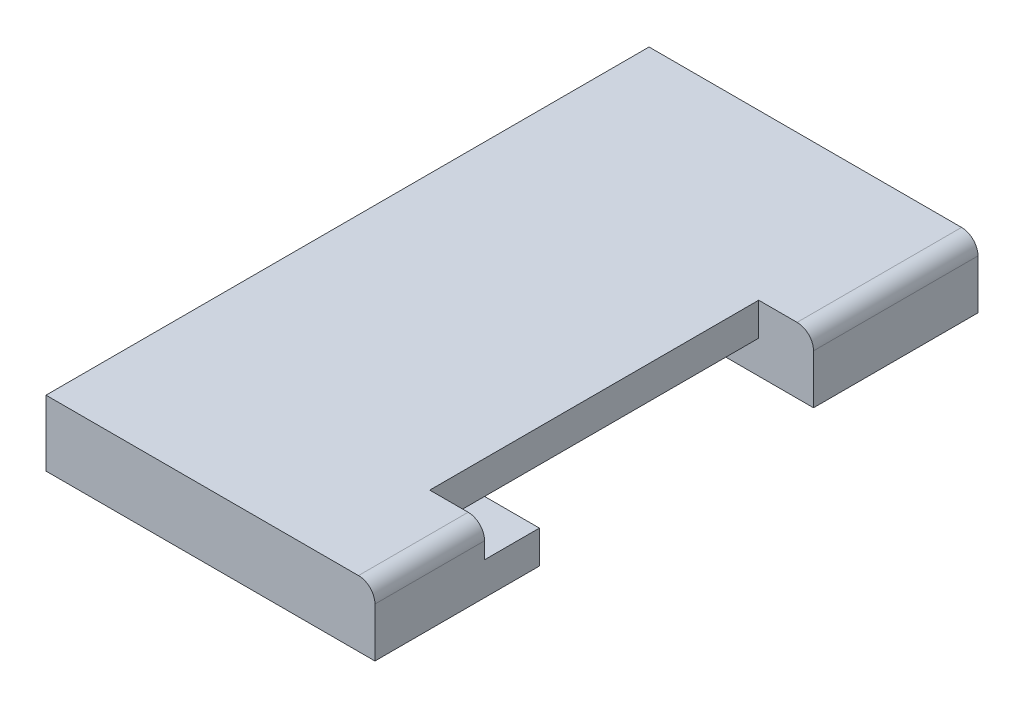
ISO-10303-21;
HEADER;
FILE_DESCRIPTION(('STEP AP214'),'2;1');
FILE_NAME('part.step','',(''),(''),'','','');
FILE_SCHEMA(('AUTOMOTIVE_DESIGN { 1 0 10303 214 1 1 1 1 }'));
ENDSEC;
DATA;
#1=APPLICATION_CONTEXT('core data for automotive mechanical design processes');
#2=APPLICATION_PROTOCOL_DEFINITION('international standard','automotive_design',2000,#1);
#3=PRODUCT_CONTEXT('',#1,'mechanical');
#4=PRODUCT('Part','Part','',(#3));
#5=PRODUCT_RELATED_PRODUCT_CATEGORY('part','',(#4));
#6=PRODUCT_DEFINITION_FORMATION('','',#4);
#7=PRODUCT_DEFINITION_CONTEXT('part definition',#1,'design');
#8=PRODUCT_DEFINITION('design','',#6,#7);
#9=PRODUCT_DEFINITION_SHAPE('','',#8);
#10=(LENGTH_UNIT() NAMED_UNIT(*) SI_UNIT(.MILLI.,.METRE.));
#11=(NAMED_UNIT(*) PLANE_ANGLE_UNIT() SI_UNIT($,.RADIAN.));
#12=(NAMED_UNIT(*) SI_UNIT($,.STERADIAN.) SOLID_ANGLE_UNIT());
#13=UNCERTAINTY_MEASURE_WITH_UNIT(LENGTH_MEASURE(1.E-05),#10,'distance_accuracy_value','');
#14=(GEOMETRIC_REPRESENTATION_CONTEXT(3) GLOBAL_UNCERTAINTY_ASSIGNED_CONTEXT((#13)) GLOBAL_UNIT_ASSIGNED_CONTEXT((#10,
#11,#12)) REPRESENTATION_CONTEXT('',''));
#15=CARTESIAN_POINT('',(0.,0.,0.));
#16=DIRECTION('',(0.,0.,1.));
#17=DIRECTION('',(1.,0.,0.));
#18=AXIS2_PLACEMENT_3D('',#15,#16,#17);
#19=CARTESIAN_POINT('',(15.,49.6074619238956,15.3952460428133));
#20=DIRECTION('',(1.,0.,0.));
#21=DIRECTION('',(0.,0.,-1.));
#22=AXIS2_PLACEMENT_3D('',#19,#20,#21);
#23=PLANE('',#22);
#24=DIRECTION('',(0.,-1.,0.));
#25=VECTOR('',#24,1.);
#26=CARTESIAN_POINT('',(15.,49.6074619238956,55.8663137595394));
#27=LINE('',#26,#25);
#28=CARTESIAN_POINT('',(15.,-59.4813638479978,55.8663137595394));
#29=VERTEX_POINT('',#28);
#30=CARTESIAN_POINT('',(15.,-63.9813638479978,55.8663137595394));
#31=VERTEX_POINT('',#30);
#32=EDGE_CURVE('E134',#29,#31,#27,.T.);
#33=ORIENTED_EDGE('',*,*,#32,.F.);
#34=DIRECTION('',(0.,0.,-1.));
#35=VECTOR('',#34,1.);
#36=CARTESIAN_POINT('',(15.,-59.4813638479978,15.3952460428133));
#37=LINE('',#36,#35);
#38=CARTESIAN_POINT('',(15.,-59.4813638479978,70.8663137595397));
#39=VERTEX_POINT('',#38);
#40=EDGE_CURVE('E142',#29,#39,#37,.F.);
#41=ORIENTED_EDGE('',*,*,#40,.T.);
#42=DIRECTION('',(0.,-1.,0.));
#43=VECTOR('',#42,1.);
#44=CARTESIAN_POINT('',(15.,-63.9813638479978,70.8663137595397));
#45=LINE('',#44,#43);
#46=CARTESIAN_POINT('',(15.,-63.9813638479978,70.8663137595397));
#47=VERTEX_POINT('',#46);
#48=EDGE_CURVE('E195',#39,#47,#45,.T.);
#49=ORIENTED_EDGE('',*,*,#48,.T.);
#50=DIRECTION('',(0.,0.,-1.));
#51=VECTOR('',#50,1.);
#52=CARTESIAN_POINT('',(15.,-63.9813638479978,-8.64642341432393));
#53=LINE('',#52,#51);
#54=EDGE_CURVE('E145',#47,#31,#53,.T.);
#55=ORIENTED_EDGE('',*,*,#54,.T.);
#56=EDGE_LOOP('',(#33,#41,#49,#55));
#57=FACE_BOUND('',#56,.T.);
#58=ADVANCED_FACE('F38',(#57),#23,.T.);
#59=CARTESIAN_POINT('',(-15.,49.6074619238956,15.3952460428133));
#60=DIRECTION('',(1.,0.,0.));
#61=DIRECTION('',(0.,0.,-1.));
#62=AXIS2_PLACEMENT_3D('',#59,#60,#61);
#63=PLANE('',#62);
#64=DIRECTION('',(0.,0.,-1.));
#65=VECTOR('',#64,1.);
#66=CARTESIAN_POINT('',(-15.,-57.9813638479978,159.79511054263));
#67=LINE('',#66,#65);
#68=CARTESIAN_POINT('',(-15.,-57.9813638479978,110.86631375954));
#69=VERTEX_POINT('',#68);
#70=CARTESIAN_POINT('',(-15.,-57.9813638479978,55.8663137595394));
#71=VERTEX_POINT('',#70);
#72=EDGE_CURVE('E170',#69,#71,#67,.T.);
#73=ORIENTED_EDGE('',*,*,#72,.T.);
#74=DIRECTION('',(0.,-1.,0.));
#75=VECTOR('',#74,1.);
#76=CARTESIAN_POINT('',(-15.,49.6074619238956,55.8663137595394));
#77=LINE('',#76,#75);
#78=CARTESIAN_POINT('',(-15.,-63.9813638479978,55.8663137595394));
#79=VERTEX_POINT('',#78);
#80=EDGE_CURVE('E147',#71,#79,#77,.T.);
#81=ORIENTED_EDGE('',*,*,#80,.T.);
#82=DIRECTION('',(0.,0.,-1.));
#83=VECTOR('',#82,1.);
#84=CARTESIAN_POINT('',(-15.,-63.9813638479978,-8.64642341432393));
#85=LINE('',#84,#83);
#86=CARTESIAN_POINT('',(-15.,-63.9813638479978,70.8663137595397));
#87=VERTEX_POINT('',#86);
#88=EDGE_CURVE('E167',#87,#79,#85,.T.);
#89=ORIENTED_EDGE('',*,*,#88,.F.);
#90=DIRECTION('',(0.,-1.,0.));
#91=VECTOR('',#90,1.);
#92=CARTESIAN_POINT('',(-15.,-63.9813638479978,70.8663137595397));
#93=LINE('',#92,#91);
#94=CARTESIAN_POINT('',(-15.,-60.9813638479978,70.8663137595397));
#95=VERTEX_POINT('',#94);
#96=EDGE_CURVE('E199',#95,#87,#93,.T.);
#97=ORIENTED_EDGE('',*,*,#96,.F.);
#98=DIRECTION('',(0.,0.,-1.));
#99=VECTOR('',#98,1.);
#100=CARTESIAN_POINT('',(-15.,-60.9813638479978,95.8663137595397));
#101=LINE('',#100,#99);
#102=CARTESIAN_POINT('',(-15.,-60.9813638479978,95.8663137595397));
#103=VERTEX_POINT('',#102);
#104=EDGE_CURVE('E177',#103,#95,#101,.T.);
#105=ORIENTED_EDGE('',*,*,#104,.F.);
#106=DIRECTION('',(0.,1.,0.));
#107=VECTOR('',#106,1.);
#108=CARTESIAN_POINT('',(-15.,-63.9813638479978,95.8663137595397));
#109=LINE('',#108,#107);
#110=CARTESIAN_POINT('',(-15.,-63.9813638479978,95.8663137595397));
#111=VERTEX_POINT('',#110);
#112=EDGE_CURVE('E169',#111,#103,#109,.T.);
#113=ORIENTED_EDGE('',*,*,#112,.F.);
#114=DIRECTION('',(0.,0.,-1.));
#115=VECTOR('',#114,1.);
#116=CARTESIAN_POINT('',(-15.,-63.9813638479978,95.8663137595397));
#117=LINE('',#116,#115);
#118=CARTESIAN_POINT('',(-15.,-63.9813638479978,110.86631375954));
#119=VERTEX_POINT('',#118);
#120=EDGE_CURVE('E168',#119,#111,#117,.T.);
#121=ORIENTED_EDGE('',*,*,#120,.F.);
#122=DIRECTION('',(0.,1.,0.));
#123=VECTOR('',#122,1.);
#124=CARTESIAN_POINT('',(-15.,49.6074619238956,110.86631375954));
#125=LINE('',#124,#123);
#126=EDGE_CURVE('E267',#119,#69,#125,.T.);
#127=ORIENTED_EDGE('',*,*,#126,.T.);
#128=EDGE_LOOP('',(#73,#81,#89,#97,#105,#113,#121,#127));
#129=FACE_BOUND('',#128,.T.);
#130=ADVANCED_FACE('F275',(#129),#63,.F.);
#131=DIRECTION('',(0.,1.,0.));
#132=VECTOR('',#131,1.);
#133=CARTESIAN_POINT('',(15.,49.6074619238956,110.86631375954));
#134=LINE('',#133,#132);
#135=CARTESIAN_POINT('',(15.,-63.9813638479978,110.86631375954));
#136=VERTEX_POINT('',#135);
#137=CARTESIAN_POINT('',(15.,-59.4813638479978,110.86631375954));
#138=VERTEX_POINT('',#137);
#139=EDGE_CURVE('E60',#136,#138,#134,.T.);
#140=ORIENTED_EDGE('',*,*,#139,.F.);
#141=DIRECTION('',(0.,0.,-1.));
#142=VECTOR('',#141,1.);
#143=CARTESIAN_POINT('',(15.,-63.9813638479978,95.8663137595397));
#144=LINE('',#143,#142);
#145=CARTESIAN_POINT('',(15.,-63.9813638479978,95.8663137595397));
#146=VERTEX_POINT('',#145);
#147=EDGE_CURVE('E165',#136,#146,#144,.T.);
#148=ORIENTED_EDGE('',*,*,#147,.T.);
#149=DIRECTION('',(0.,1.,0.));
#150=VECTOR('',#149,1.);
#151=CARTESIAN_POINT('',(15.,-63.9813638479978,95.8663137595397));
#152=LINE('',#151,#150);
#153=CARTESIAN_POINT('',(15.,-60.9813638479978,95.8663137595397));
#154=VERTEX_POINT('',#153);
#155=EDGE_CURVE('E166',#146,#154,#152,.T.);
#156=ORIENTED_EDGE('',*,*,#155,.T.);
#157=DIRECTION('',(0.,0.,1.));
#158=VECTOR('',#157,1.);
#159=CARTESIAN_POINT('',(15.,-60.9813638479978,70.8663137595397));
#160=LINE('',#159,#158);
#161=CARTESIAN_POINT('',(15.,-60.9813638479978,100.86631375954));
#162=VERTEX_POINT('',#161);
#163=EDGE_CURVE('E241',#154,#162,#160,.T.);
#164=ORIENTED_EDGE('',*,*,#163,.T.);
#165=DIRECTION('',(0.,-1.,0.));
#166=VECTOR('',#165,1.);
#167=CARTESIAN_POINT('',(15.,68.6081610265294,100.86631375954));
#168=LINE('',#167,#166);
#169=CARTESIAN_POINT('',(15.,-59.4813638479978,100.86631375954));
#170=VERTEX_POINT('',#169);
#171=EDGE_CURVE('E187',#170,#162,#168,.T.);
#172=ORIENTED_EDGE('',*,*,#171,.F.);
#173=DIRECTION('',(0.,0.,-1.));
#174=VECTOR('',#173,1.);
#175=CARTESIAN_POINT('',(15.,-59.4813638479978,15.3952460428133));
#176=LINE('',#175,#174);
#177=EDGE_CURVE('E152',#170,#138,#176,.F.);
#178=ORIENTED_EDGE('',*,*,#177,.T.);
#179=EDGE_LOOP('',(#140,#148,#156,#164,#172,#178));
#180=FACE_BOUND('',#179,.T.);
#181=ADVANCED_FACE('F258',(#180),#23,.T.);
#182=CARTESIAN_POINT('',(15.,-63.9813638479978,95.8663137595397));
#183=DIRECTION('',(0.,1.,0.));
#184=DIRECTION('',(0.,0.,1.));
#185=AXIS2_PLACEMENT_3D('',#182,#183,#184);
#186=PLANE('',#185);
#187=ORIENTED_EDGE('',*,*,#147,.F.);
#188=DIRECTION('',(-1.,0.,0.));
#189=VECTOR('',#188,1.);
#190=CARTESIAN_POINT('',(15.,-63.9813638479978,110.86631375954));
#191=LINE('',#190,#189);
#192=EDGE_CURVE('E263',#136,#119,#191,.T.);
#193=ORIENTED_EDGE('',*,*,#192,.T.);
#194=ORIENTED_EDGE('',*,*,#120,.T.);
#195=DIRECTION('',(-1.,0.,0.));
#196=VECTOR('',#195,1.);
#197=CARTESIAN_POINT('',(15.,-63.9813638479978,95.8663137595397));
#198=LINE('',#197,#196);
#199=EDGE_CURVE('E209',#146,#111,#198,.T.);
#200=ORIENTED_EDGE('',*,*,#199,.F.);
#201=EDGE_LOOP('',(#187,#193,#194,#200));
#202=FACE_BOUND('',#201,.T.);
#203=ADVANCED_FACE('F288',(#202),#186,.F.);
#204=CARTESIAN_POINT('',(15.,-63.9813638479978,95.8663137595397));
#205=DIRECTION('',(0.,0.,1.));
#206=DIRECTION('',(1.,0.,0.));
#207=AXIS2_PLACEMENT_3D('',#204,#205,#206);
#208=PLANE('',#207);
#209=ORIENTED_EDGE('',*,*,#112,.T.);
#210=DIRECTION('',(-1.,0.,0.));
#211=VECTOR('',#210,1.);
#212=CARTESIAN_POINT('',(15.,-60.9813638479978,95.8663137595397));
#213=LINE('',#212,#211);
#214=CARTESIAN_POINT('',(10.,-60.9813638479978,95.8663137595397));
#215=VERTEX_POINT('',#214);
#216=EDGE_CURVE('E206',#215,#103,#213,.T.);
#217=ORIENTED_EDGE('',*,*,#216,.F.);
#218=EDGE_CURVE('E207',#154,#215,#213,.T.);
#219=ORIENTED_EDGE('',*,*,#218,.F.);
#220=ORIENTED_EDGE('',*,*,#155,.F.);
#221=ORIENTED_EDGE('',*,*,#199,.T.);
#222=EDGE_LOOP('',(#209,#217,#219,#220,#221));
#223=FACE_BOUND('',#222,.T.);
#224=ADVANCED_FACE('F286',(#223),#208,.F.);
#225=CARTESIAN_POINT('',(15.,-60.9813638479978,95.8663137595397));
#226=DIRECTION('',(0.,1.,0.));
#227=DIRECTION('',(0.,0.,1.));
#228=AXIS2_PLACEMENT_3D('',#225,#226,#227);
#229=PLANE('',#228);
#230=DIRECTION('',(-1.,0.,0.));
#231=VECTOR('',#230,1.);
#232=CARTESIAN_POINT('',(15.,-60.9813638479978,70.8663137595397));
#233=LINE('',#232,#231);
#234=CARTESIAN_POINT('',(10.,-60.9813638479978,70.8663137595397));
#235=VERTEX_POINT('',#234);
#236=EDGE_CURVE('E204',#235,#95,#233,.T.);
#237=ORIENTED_EDGE('',*,*,#236,.F.);
#238=DIRECTION('',(0.,0.,-1.));
#239=VECTOR('',#238,1.);
#240=CARTESIAN_POINT('',(10.,-60.9813638479978,70.8663137595397));
#241=LINE('',#240,#239);
#242=EDGE_CURVE('E234',#215,#235,#241,.T.);
#243=ORIENTED_EDGE('',*,*,#242,.F.);
#244=ORIENTED_EDGE('',*,*,#216,.T.);
#245=ORIENTED_EDGE('',*,*,#104,.T.);
#246=EDGE_LOOP('',(#237,#243,#244,#245));
#247=FACE_BOUND('',#246,.T.);
#248=ADVANCED_FACE('F283',(#247),#229,.F.);
#249=CARTESIAN_POINT('',(15.,-63.9813638479978,70.8663137595397));
#250=DIRECTION('',(0.,0.,-1.));
#251=DIRECTION('',(0.,1.,0.));
#252=AXIS2_PLACEMENT_3D('',#249,#250,#251);
#253=PLANE('',#252);
#254=ORIENTED_EDGE('',*,*,#48,.F.);
#255=CARTESIAN_POINT('',(13.5,-59.4813638479978,70.8663137595397));
#256=DIRECTION('',(0.,0.,-1.));
#257=DIRECTION('',(0.,1.,0.));
#258=AXIS2_PLACEMENT_3D('',#255,#256,#257);
#259=CIRCLE('',#258,1.5);
#260=CARTESIAN_POINT('',(13.5,-57.9813638479978,70.8663137595397));
#261=VERTEX_POINT('',#260);
#262=EDGE_CURVE('E151',#39,#261,#259,.F.);
#263=ORIENTED_EDGE('',*,*,#262,.T.);
#264=DIRECTION('',(1.,0.,0.));
#265=VECTOR('',#264,1.);
#266=CARTESIAN_POINT('',(10.,-57.9813638479978,70.8663137595397));
#267=LINE('',#266,#265);
#268=CARTESIAN_POINT('',(10.,-57.9813638479978,70.8663137595397));
#269=VERTEX_POINT('',#268);
#270=EDGE_CURVE('E180',#269,#261,#267,.T.);
#271=ORIENTED_EDGE('',*,*,#270,.F.);
#272=DIRECTION('',(0.,-1.,0.));
#273=VECTOR('',#272,1.);
#274=CARTESIAN_POINT('',(10.,68.6081610265294,70.8663137595397));
#275=LINE('',#274,#273);
#276=EDGE_CURVE('E191',#269,#235,#275,.T.);
#277=ORIENTED_EDGE('',*,*,#276,.T.);
#278=ORIENTED_EDGE('',*,*,#236,.T.);
#279=ORIENTED_EDGE('',*,*,#96,.T.);
#280=DIRECTION('',(-1.,0.,0.));
#281=VECTOR('',#280,1.);
#282=CARTESIAN_POINT('',(15.,-63.9813638479978,70.8663137595397));
#283=LINE('',#282,#281);
#284=EDGE_CURVE('E201',#47,#87,#283,.T.);
#285=ORIENTED_EDGE('',*,*,#284,.F.);
#286=EDGE_LOOP('',(#254,#263,#271,#277,#278,#279,#285));
#287=FACE_BOUND('',#286,.T.);
#288=ADVANCED_FACE('F227',(#287),#253,.F.);
#289=CARTESIAN_POINT('',(15.,-63.9813638479978,-8.64642341432393));
#290=DIRECTION('',(0.,1.,0.));
#291=DIRECTION('',(0.,0.,1.));
#292=AXIS2_PLACEMENT_3D('',#289,#290,#291);
#293=PLANE('',#292);
#294=ORIENTED_EDGE('',*,*,#88,.T.);
#295=DIRECTION('',(1.,0.,0.));
#296=VECTOR('',#295,1.);
#297=CARTESIAN_POINT('',(15.,-63.9813638479978,55.8663137595394));
#298=LINE('',#297,#296);
#299=EDGE_CURVE('E146',#79,#31,#298,.T.);
#300=ORIENTED_EDGE('',*,*,#299,.T.);
#301=ORIENTED_EDGE('',*,*,#54,.F.);
#302=ORIENTED_EDGE('',*,*,#284,.T.);
#303=EDGE_LOOP('',(#294,#300,#301,#302));
#304=FACE_BOUND('',#303,.T.);
#305=ADVANCED_FACE('F278',(#304),#293,.F.);
#306=CARTESIAN_POINT('',(15.,-57.9813638479978,159.79511054263));
#307=DIRECTION('',(0.,1.,0.));
#308=DIRECTION('',(0.,0.,1.));
#309=AXIS2_PLACEMENT_3D('',#306,#307,#308);
#310=PLANE('',#309);
#311=DIRECTION('',(1.,0.,0.));
#312=VECTOR('',#311,1.);
#313=CARTESIAN_POINT('',(15.,-57.9813638479978,55.8663137595394));
#314=LINE('',#313,#312);
#315=CARTESIAN_POINT('',(13.5,-57.9813638479978,55.8663137595394));
#316=VERTEX_POINT('',#315);
#317=EDGE_CURVE('E52',#71,#316,#314,.T.);
#318=ORIENTED_EDGE('',*,*,#317,.F.);
#319=ORIENTED_EDGE('',*,*,#72,.F.);
#320=DIRECTION('',(-1.,0.,0.));
#321=VECTOR('',#320,1.);
#322=CARTESIAN_POINT('',(15.,-57.9813638479978,110.86631375954));
#323=LINE('',#322,#321);
#324=CARTESIAN_POINT('',(13.5,-57.9813638479978,110.86631375954));
#325=VERTEX_POINT('',#324);
#326=EDGE_CURVE('E265',#325,#69,#323,.T.);
#327=ORIENTED_EDGE('',*,*,#326,.F.);
#328=DIRECTION('',(0.,0.,-1.));
#329=VECTOR('',#328,1.);
#330=CARTESIAN_POINT('',(13.5,-57.9813638479978,159.79511054263));
#331=LINE('',#330,#329);
#332=CARTESIAN_POINT('',(13.5,-57.9813638479978,100.86631375954));
#333=VERTEX_POINT('',#332);
#334=EDGE_CURVE('E211',#325,#333,#331,.T.);
#335=ORIENTED_EDGE('',*,*,#334,.T.);
#336=DIRECTION('',(-1.,0.,0.));
#337=VECTOR('',#336,1.);
#338=CARTESIAN_POINT('',(10.,-57.9813638479978,100.86631375954));
#339=LINE('',#338,#337);
#340=CARTESIAN_POINT('',(10.,-57.9813638479978,100.86631375954));
#341=VERTEX_POINT('',#340);
#342=EDGE_CURVE('E235',#333,#341,#339,.T.);
#343=ORIENTED_EDGE('',*,*,#342,.T.);
#344=DIRECTION('',(0.,0.,-1.));
#345=VECTOR('',#344,1.);
#346=CARTESIAN_POINT('',(10.,-57.9813638479978,70.8663137595397));
#347=LINE('',#346,#345);
#348=EDGE_CURVE('E223',#341,#269,#347,.T.);
#349=ORIENTED_EDGE('',*,*,#348,.T.);
#350=ORIENTED_EDGE('',*,*,#270,.T.);
#351=DIRECTION('',(0.,0.,-1.));
#352=VECTOR('',#351,1.);
#353=CARTESIAN_POINT('',(13.5,-57.9813638479978,159.79511054263));
#354=LINE('',#353,#352);
#355=EDGE_CURVE('E156',#261,#316,#354,.T.);
#356=ORIENTED_EDGE('',*,*,#355,.T.);
#357=EDGE_LOOP('',(#318,#319,#327,#335,#343,#349,#350,#356));
#358=FACE_BOUND('',#357,.T.);
#359=ADVANCED_FACE('F220',(#358),#310,.T.);
#360=CARTESIAN_POINT('',(0.,-60.9813638479978,0.));
#361=DIRECTION('',(0.,1.,0.));
#362=DIRECTION('',(0.,0.,1.));
#363=AXIS2_PLACEMENT_3D('',#360,#361,#362);
#364=PLANE('',#363);
#365=ORIENTED_EDGE('',*,*,#218,.T.);
#366=CARTESIAN_POINT('',(10.,-60.9813638479978,100.86631375954));
#367=VERTEX_POINT('',#366);
#368=EDGE_CURVE('E257',#367,#215,#241,.T.);
#369=ORIENTED_EDGE('',*,*,#368,.F.);
#370=DIRECTION('',(-1.,0.,0.));
#371=VECTOR('',#370,1.);
#372=CARTESIAN_POINT('',(10.,-60.9813638479978,100.86631375954));
#373=LINE('',#372,#371);
#374=EDGE_CURVE('E238',#162,#367,#373,.T.);
#375=ORIENTED_EDGE('',*,*,#374,.F.);
#376=ORIENTED_EDGE('',*,*,#163,.F.);
#377=EDGE_LOOP('',(#365,#369,#375,#376));
#378=FACE_BOUND('',#377,.T.);
#379=ADVANCED_FACE('F256',(#378),#364,.T.);
#380=CARTESIAN_POINT('',(10.,68.6081610265294,70.8663137595397));
#381=DIRECTION('',(-1.,0.,0.));
#382=DIRECTION('',(0.,0.,1.));
#383=AXIS2_PLACEMENT_3D('',#380,#381,#382);
#384=PLANE('',#383);
#385=DIRECTION('',(0.,-1.,0.));
#386=VECTOR('',#385,1.);
#387=CARTESIAN_POINT('',(10.,68.6081610265294,100.86631375954));
#388=LINE('',#387,#386);
#389=EDGE_CURVE('E236',#341,#367,#388,.T.);
#390=ORIENTED_EDGE('',*,*,#389,.T.);
#391=ORIENTED_EDGE('',*,*,#368,.T.);
#392=ORIENTED_EDGE('',*,*,#242,.T.);
#393=ORIENTED_EDGE('',*,*,#276,.F.);
#394=ORIENTED_EDGE('',*,*,#348,.F.);
#395=EDGE_LOOP('',(#390,#391,#392,#393,#394));
#396=FACE_BOUND('',#395,.T.);
#397=ADVANCED_FACE('F230',(#396),#384,.F.);
#398=CARTESIAN_POINT('',(10.,68.6081610265294,100.86631375954));
#399=DIRECTION('',(0.,0.,1.));
#400=DIRECTION('',(1.,0.,0.));
#401=AXIS2_PLACEMENT_3D('',#398,#399,#400);
#402=PLANE('',#401);
#403=ORIENTED_EDGE('',*,*,#342,.F.);
#404=CARTESIAN_POINT('',(13.5,-59.4813638479978,100.86631375954));
#405=DIRECTION('',(0.,0.,1.));
#406=DIRECTION('',(1.,0.,0.));
#407=AXIS2_PLACEMENT_3D('',#404,#405,#406);
#408=CIRCLE('',#407,1.5);
#409=EDGE_CURVE('E46',#333,#170,#408,.F.);
#410=ORIENTED_EDGE('',*,*,#409,.T.);
#411=ORIENTED_EDGE('',*,*,#171,.T.);
#412=ORIENTED_EDGE('',*,*,#374,.T.);
#413=ORIENTED_EDGE('',*,*,#389,.F.);
#414=EDGE_LOOP('',(#403,#410,#411,#412,#413));
#415=FACE_BOUND('',#414,.T.);
#416=ADVANCED_FACE('F249',(#415),#402,.F.);
#417=CARTESIAN_POINT('',(13.5,-59.4813638479978,159.79511054263));
#418=DIRECTION('',(0.,0.,-1.));
#419=DIRECTION('',(0.,1.,0.));
#420=AXIS2_PLACEMENT_3D('',#417,#418,#419);
#421=CYLINDRICAL_SURFACE('',#420,1.5);
#422=CARTESIAN_POINT('',(13.5,-59.4813638479978,110.86631375954));
#423=DIRECTION('',(0.,0.,-1.));
#424=DIRECTION('',(-1.,0.,0.));
#425=AXIS2_PLACEMENT_3D('',#422,#423,#424);
#426=CIRCLE('',#425,1.5);
#427=EDGE_CURVE('E268',#138,#325,#426,.F.);
#428=ORIENTED_EDGE('',*,*,#427,.F.);
#429=ORIENTED_EDGE('',*,*,#177,.F.);
#430=ORIENTED_EDGE('',*,*,#409,.F.);
#431=ORIENTED_EDGE('',*,*,#334,.F.);
#432=EDGE_LOOP('',(#428,#429,#430,#431));
#433=FACE_BOUND('',#432,.T.);
#434=ADVANCED_FACE('F40',(#433),#421,.T.);
#435=CARTESIAN_POINT('',(13.5,-59.4813638479978,159.79511054263));
#436=DIRECTION('',(0.,0.,-1.));
#437=DIRECTION('',(0.,1.,0.));
#438=AXIS2_PLACEMENT_3D('',#435,#436,#437);
#439=CYLINDRICAL_SURFACE('',#438,1.5);
#440=CARTESIAN_POINT('',(13.5,-59.4813638479978,55.8663137595394));
#441=DIRECTION('',(0.,0.,1.));
#442=DIRECTION('',(1.,0.,0.));
#443=AXIS2_PLACEMENT_3D('',#440,#441,#442);
#444=CIRCLE('',#443,1.5);
#445=EDGE_CURVE('E11',#316,#29,#444,.F.);
#446=ORIENTED_EDGE('',*,*,#445,.F.);
#447=ORIENTED_EDGE('',*,*,#355,.F.);
#448=ORIENTED_EDGE('',*,*,#262,.F.);
#449=ORIENTED_EDGE('',*,*,#40,.F.);
#450=EDGE_LOOP('',(#446,#447,#448,#449));
#451=FACE_BOUND('',#450,.T.);
#452=ADVANCED_FACE('F150',(#451),#439,.T.);
#453=CARTESIAN_POINT('',(0.,0.,110.86631375954));
#454=DIRECTION('',(0.,0.,-1.));
#455=DIRECTION('',(-1.,0.,0.));
#456=AXIS2_PLACEMENT_3D('',#453,#454,#455);
#457=PLANE('',#456);
#458=ORIENTED_EDGE('',*,*,#139,.T.);
#459=ORIENTED_EDGE('',*,*,#427,.T.);
#460=ORIENTED_EDGE('',*,*,#326,.T.);
#461=ORIENTED_EDGE('',*,*,#126,.F.);
#462=ORIENTED_EDGE('',*,*,#192,.F.);
#463=EDGE_LOOP('',(#458,#459,#460,#461,#462));
#464=FACE_BOUND('',#463,.T.);
#465=ADVANCED_FACE('F292',(#464),#457,.F.);
#466=CARTESIAN_POINT('',(0.,0.,55.8663137595394));
#467=DIRECTION('',(0.,0.,1.));
#468=DIRECTION('',(1.,0.,0.));
#469=AXIS2_PLACEMENT_3D('',#466,#467,#468);
#470=PLANE('',#469);
#471=ORIENTED_EDGE('',*,*,#80,.F.);
#472=ORIENTED_EDGE('',*,*,#317,.T.);
#473=ORIENTED_EDGE('',*,*,#445,.T.);
#474=ORIENTED_EDGE('',*,*,#32,.T.);
#475=ORIENTED_EDGE('',*,*,#299,.F.);
#476=EDGE_LOOP('',(#471,#472,#473,#474,#475));
#477=FACE_BOUND('',#476,.T.);
#478=ADVANCED_FACE('F133',(#477),#470,.F.);
#479=CLOSED_SHELL('',(#58,#130,#181,#203,#224,#248,#288,#305,#359,#379,#397,#416,#434,#452,#465,#478));
#480=MANIFOLD_SOLID_BREP('B2',#479);
#481=ADVANCED_BREP_SHAPE_REPRESENTATION('',(#18,#480),#14);
#482=SHAPE_DEFINITION_REPRESENTATION(#9,#481);
ENDSEC;
END-ISO-10303-21;
